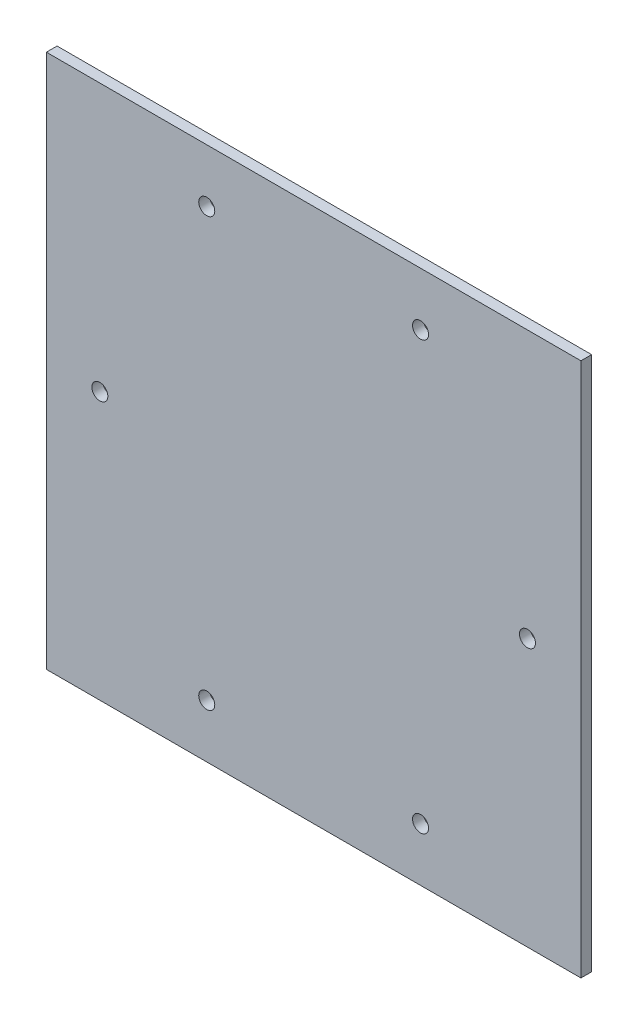
ISO-10303-21;
HEADER;
FILE_DESCRIPTION(('STEP AP214'),'2;1');
FILE_NAME('part.step','',(''),(''),'','','');
FILE_SCHEMA(('AUTOMOTIVE_DESIGN { 1 0 10303 214 1 1 1 1 }'));
ENDSEC;
DATA;
#1=APPLICATION_CONTEXT('core data for automotive mechanical design processes');
#2=APPLICATION_PROTOCOL_DEFINITION('international standard','automotive_design',2000,#1);
#3=PRODUCT_CONTEXT('',#1,'mechanical');
#4=PRODUCT('Part','Part','',(#3));
#5=PRODUCT_RELATED_PRODUCT_CATEGORY('part','',(#4));
#6=PRODUCT_DEFINITION_FORMATION('','',#4);
#7=PRODUCT_DEFINITION_CONTEXT('part definition',#1,'design');
#8=PRODUCT_DEFINITION('design','',#6,#7);
#9=PRODUCT_DEFINITION_SHAPE('','',#8);
#10=(LENGTH_UNIT() NAMED_UNIT(*) SI_UNIT(.MILLI.,.METRE.));
#11=(NAMED_UNIT(*) PLANE_ANGLE_UNIT() SI_UNIT($,.RADIAN.));
#12=(NAMED_UNIT(*) SI_UNIT($,.STERADIAN.) SOLID_ANGLE_UNIT());
#13=UNCERTAINTY_MEASURE_WITH_UNIT(LENGTH_MEASURE(1.E-05),#10,'distance_accuracy_value','');
#14=(GEOMETRIC_REPRESENTATION_CONTEXT(3) GLOBAL_UNCERTAINTY_ASSIGNED_CONTEXT((#13)) GLOBAL_UNIT_ASSIGNED_CONTEXT((#10,
#11,#12)) REPRESENTATION_CONTEXT('',''));
#15=CARTESIAN_POINT('',(0.,0.,0.));
#16=DIRECTION('',(0.,0.,1.));
#17=DIRECTION('',(1.,0.,0.));
#18=AXIS2_PLACEMENT_3D('',#15,#16,#17);
#19=CARTESIAN_POINT('',(50.,50.,2.));
#20=DIRECTION('',(0.,0.,-1.));
#21=DIRECTION('',(-1.,0.,0.));
#22=AXIS2_PLACEMENT_3D('',#19,#20,#21);
#23=PLANE('',#22);
#24=CARTESIAN_POINT('',(-20.,-40.,2.));
#25=DIRECTION('',(0.,0.,-1.));
#26=DIRECTION('',(1.,0.,0.));
#27=AXIS2_PLACEMENT_3D('',#24,#25,#26);
#28=CIRCLE('',#27,1.5);
#29=CARTESIAN_POINT('',(-18.5,-40.,2.));
#30=VERTEX_POINT('',#29);
#31=EDGE_CURVE('E124',#30,#30,#28,.T.);
#32=ORIENTED_EDGE('',*,*,#31,.T.);
#33=EDGE_LOOP('',(#32));
#34=FACE_BOUND('',#33,.T.);
#35=DIRECTION('',(0.,1.,0.));
#36=VECTOR('',#35,1.);
#37=CARTESIAN_POINT('',(50.,-50.,2.));
#38=LINE('',#37,#36);
#39=CARTESIAN_POINT('',(50.,-50.,2.));
#40=VERTEX_POINT('',#39);
#41=CARTESIAN_POINT('',(50.,50.,2.));
#42=VERTEX_POINT('',#41);
#43=EDGE_CURVE('E86',#40,#42,#38,.T.);
#44=ORIENTED_EDGE('',*,*,#43,.T.);
#45=DIRECTION('',(-1.,0.,0.));
#46=VECTOR('',#45,1.);
#47=CARTESIAN_POINT('',(-50.,50.,2.));
#48=LINE('',#47,#46);
#49=CARTESIAN_POINT('',(-50.,50.,2.));
#50=VERTEX_POINT('',#49);
#51=EDGE_CURVE('E81',#42,#50,#48,.T.);
#52=ORIENTED_EDGE('',*,*,#51,.T.);
#53=DIRECTION('',(0.,-1.,0.));
#54=VECTOR('',#53,1.);
#55=CARTESIAN_POINT('',(-50.,-50.,2.));
#56=LINE('',#55,#54);
#57=CARTESIAN_POINT('',(-50.,-50.,2.));
#58=VERTEX_POINT('',#57);
#59=EDGE_CURVE('E84',#50,#58,#56,.T.);
#60=ORIENTED_EDGE('',*,*,#59,.T.);
#61=DIRECTION('',(1.,0.,0.));
#62=VECTOR('',#61,1.);
#63=CARTESIAN_POINT('',(-50.,-50.,2.));
#64=LINE('',#63,#62);
#65=EDGE_CURVE('E51',#58,#40,#64,.T.);
#66=ORIENTED_EDGE('',*,*,#65,.T.);
#67=EDGE_LOOP('',(#44,#52,#60,#66));
#68=FACE_BOUND('',#67,.T.);
#69=CARTESIAN_POINT('',(-20.,40.,2.));
#70=DIRECTION('',(0.,0.,1.));
#71=DIRECTION('',(1.,0.,0.));
#72=AXIS2_PLACEMENT_3D('',#69,#70,#71);
#73=CIRCLE('',#72,1.5);
#74=CARTESIAN_POINT('',(-18.5,40.,2.));
#75=VERTEX_POINT('',#74);
#76=EDGE_CURVE('E110',#75,#75,#73,.T.);
#77=ORIENTED_EDGE('',*,*,#76,.F.);
#78=EDGE_LOOP('',(#77));
#79=FACE_BOUND('',#78,.T.);
#80=CARTESIAN_POINT('',(20.,40.,2.));
#81=DIRECTION('',(0.,0.,1.));
#82=DIRECTION('',(1.,0.,0.));
#83=AXIS2_PLACEMENT_3D('',#80,#81,#82);
#84=CIRCLE('',#83,1.5);
#85=CARTESIAN_POINT('',(21.5,40.,2.));
#86=VERTEX_POINT('',#85);
#87=EDGE_CURVE('E114',#86,#86,#84,.T.);
#88=ORIENTED_EDGE('',*,*,#87,.F.);
#89=EDGE_LOOP('',(#88));
#90=FACE_BOUND('',#89,.T.);
#91=CARTESIAN_POINT('',(-40.,0.,2.));
#92=DIRECTION('',(0.,0.,1.));
#93=DIRECTION('',(1.,0.,0.));
#94=AXIS2_PLACEMENT_3D('',#91,#92,#93);
#95=CIRCLE('',#94,1.5);
#96=CARTESIAN_POINT('',(-38.5,0.,2.));
#97=VERTEX_POINT('',#96);
#98=EDGE_CURVE('E118',#97,#97,#95,.T.);
#99=ORIENTED_EDGE('',*,*,#98,.F.);
#100=EDGE_LOOP('',(#99));
#101=FACE_BOUND('',#100,.T.);
#102=CARTESIAN_POINT('',(40.,0.,2.));
#103=DIRECTION('',(0.,0.,-1.));
#104=DIRECTION('',(-1.,0.,0.));
#105=AXIS2_PLACEMENT_3D('',#102,#103,#104);
#106=CIRCLE('',#105,1.5);
#107=CARTESIAN_POINT('',(38.5,0.,2.));
#108=VERTEX_POINT('',#107);
#109=EDGE_CURVE('E121',#108,#108,#106,.T.);
#110=ORIENTED_EDGE('',*,*,#109,.T.);
#111=EDGE_LOOP('',(#110));
#112=FACE_BOUND('',#111,.T.);
#113=CARTESIAN_POINT('',(20.,-40.,2.));
#114=DIRECTION('',(0.,0.,-1.));
#115=DIRECTION('',(1.,0.,0.));
#116=AXIS2_PLACEMENT_3D('',#113,#114,#115);
#117=CIRCLE('',#116,1.5);
#118=CARTESIAN_POINT('',(21.5,-40.,2.));
#119=VERTEX_POINT('',#118);
#120=EDGE_CURVE('E134',#119,#119,#117,.T.);
#121=ORIENTED_EDGE('',*,*,#120,.T.);
#122=EDGE_LOOP('',(#121));
#123=FACE_BOUND('',#122,.T.);
#124=ADVANCED_FACE('F32',(#34,#68,#79,#90,#101,#112,#123),#23,.F.);
#125=CARTESIAN_POINT('',(50.,50.,0.));
#126=DIRECTION('',(0.,0.,-1.));
#127=DIRECTION('',(-1.,0.,0.));
#128=AXIS2_PLACEMENT_3D('',#125,#126,#127);
#129=PLANE('',#128);
#130=CARTESIAN_POINT('',(-20.,-40.,0.));
#131=DIRECTION('',(0.,0.,-1.));
#132=DIRECTION('',(-1.,0.,0.));
#133=AXIS2_PLACEMENT_3D('',#130,#131,#132);
#134=CIRCLE('',#133,1.5);
#135=CARTESIAN_POINT('',(-21.5,-40.,0.));
#136=VERTEX_POINT('',#135);
#137=EDGE_CURVE('E122',#136,#136,#134,.F.);
#138=ORIENTED_EDGE('',*,*,#137,.T.);
#139=EDGE_LOOP('',(#138));
#140=FACE_BOUND('',#139,.T.);
#141=DIRECTION('',(0.,1.,0.));
#142=VECTOR('',#141,1.);
#143=CARTESIAN_POINT('',(50.,-50.,0.));
#144=LINE('',#143,#142);
#145=CARTESIAN_POINT('',(50.,-50.,0.));
#146=VERTEX_POINT('',#145);
#147=CARTESIAN_POINT('',(50.,50.,0.));
#148=VERTEX_POINT('',#147);
#149=EDGE_CURVE('E99',#146,#148,#144,.T.);
#150=ORIENTED_EDGE('',*,*,#149,.F.);
#151=DIRECTION('',(1.,0.,0.));
#152=VECTOR('',#151,1.);
#153=CARTESIAN_POINT('',(-50.,-50.,0.));
#154=LINE('',#153,#152);
#155=CARTESIAN_POINT('',(-50.,-50.,0.));
#156=VERTEX_POINT('',#155);
#157=EDGE_CURVE('E74',#156,#146,#154,.T.);
#158=ORIENTED_EDGE('',*,*,#157,.F.);
#159=DIRECTION('',(0.,-1.,0.));
#160=VECTOR('',#159,1.);
#161=CARTESIAN_POINT('',(-50.,-50.,0.));
#162=LINE('',#161,#160);
#163=CARTESIAN_POINT('',(-50.,50.,0.));
#164=VERTEX_POINT('',#163);
#165=EDGE_CURVE('E68',#164,#156,#162,.T.);
#166=ORIENTED_EDGE('',*,*,#165,.F.);
#167=DIRECTION('',(-1.,0.,0.));
#168=VECTOR('',#167,1.);
#169=CARTESIAN_POINT('',(-50.,50.,0.));
#170=LINE('',#169,#168);
#171=EDGE_CURVE('E90',#148,#164,#170,.T.);
#172=ORIENTED_EDGE('',*,*,#171,.F.);
#173=EDGE_LOOP('',(#150,#158,#166,#172));
#174=FACE_BOUND('',#173,.T.);
#175=CARTESIAN_POINT('',(-20.,40.,0.));
#176=DIRECTION('',(0.,0.,-1.));
#177=DIRECTION('',(-1.,0.,0.));
#178=AXIS2_PLACEMENT_3D('',#175,#176,#177);
#179=CIRCLE('',#178,1.5);
#180=CARTESIAN_POINT('',(-21.5,40.,0.));
#181=VERTEX_POINT('',#180);
#182=EDGE_CURVE('E102',#181,#181,#179,.T.);
#183=ORIENTED_EDGE('',*,*,#182,.F.);
#184=EDGE_LOOP('',(#183));
#185=FACE_BOUND('',#184,.T.);
#186=CARTESIAN_POINT('',(20.,40.,0.));
#187=DIRECTION('',(0.,0.,-1.));
#188=DIRECTION('',(-1.,0.,0.));
#189=AXIS2_PLACEMENT_3D('',#186,#187,#188);
#190=CIRCLE('',#189,1.5);
#191=CARTESIAN_POINT('',(18.5,40.,0.));
#192=VERTEX_POINT('',#191);
#193=EDGE_CURVE('E111',#192,#192,#190,.T.);
#194=ORIENTED_EDGE('',*,*,#193,.F.);
#195=EDGE_LOOP('',(#194));
#196=FACE_BOUND('',#195,.T.);
#197=CARTESIAN_POINT('',(-40.,0.,0.));
#198=DIRECTION('',(0.,0.,-1.));
#199=DIRECTION('',(-1.,0.,0.));
#200=AXIS2_PLACEMENT_3D('',#197,#198,#199);
#201=CIRCLE('',#200,1.5);
#202=CARTESIAN_POINT('',(-41.5,0.,0.));
#203=VERTEX_POINT('',#202);
#204=EDGE_CURVE('E115',#203,#203,#201,.T.);
#205=ORIENTED_EDGE('',*,*,#204,.F.);
#206=EDGE_LOOP('',(#205));
#207=FACE_BOUND('',#206,.T.);
#208=CARTESIAN_POINT('',(40.,0.,0.));
#209=DIRECTION('',(0.,0.,-1.));
#210=DIRECTION('',(-1.,0.,0.));
#211=AXIS2_PLACEMENT_3D('',#208,#209,#210);
#212=CIRCLE('',#211,1.5);
#213=CARTESIAN_POINT('',(38.5,0.,0.));
#214=VERTEX_POINT('',#213);
#215=EDGE_CURVE('E119',#214,#214,#212,.F.);
#216=ORIENTED_EDGE('',*,*,#215,.T.);
#217=EDGE_LOOP('',(#216));
#218=FACE_BOUND('',#217,.T.);
#219=CARTESIAN_POINT('',(20.,-40.,0.));
#220=DIRECTION('',(0.,0.,-1.));
#221=DIRECTION('',(-1.,0.,0.));
#222=AXIS2_PLACEMENT_3D('',#219,#220,#221);
#223=CIRCLE('',#222,1.5);
#224=CARTESIAN_POINT('',(18.5,-40.,0.));
#225=VERTEX_POINT('',#224);
#226=EDGE_CURVE('E36',#225,#225,#223,.F.);
#227=ORIENTED_EDGE('',*,*,#226,.T.);
#228=EDGE_LOOP('',(#227));
#229=FACE_BOUND('',#228,.T.);
#230=ADVANCED_FACE('F147',(#140,#174,#185,#196,#207,#218,#229),#129,.T.);
#231=CARTESIAN_POINT('',(50.,-50.,2.));
#232=DIRECTION('',(-1.,0.,0.));
#233=DIRECTION('',(0.,0.,1.));
#234=AXIS2_PLACEMENT_3D('',#231,#232,#233);
#235=PLANE('',#234);
#236=ORIENTED_EDGE('',*,*,#149,.T.);
#237=DIRECTION('',(0.,0.,-1.));
#238=VECTOR('',#237,1.);
#239=CARTESIAN_POINT('',(50.,50.,2.));
#240=LINE('',#239,#238);
#241=EDGE_CURVE('E11',#42,#148,#240,.T.);
#242=ORIENTED_EDGE('',*,*,#241,.F.);
#243=ORIENTED_EDGE('',*,*,#43,.F.);
#244=DIRECTION('',(0.,0.,-1.));
#245=VECTOR('',#244,1.);
#246=CARTESIAN_POINT('',(50.,-50.,2.));
#247=LINE('',#246,#245);
#248=EDGE_CURVE('E95',#40,#146,#247,.T.);
#249=ORIENTED_EDGE('',*,*,#248,.T.);
#250=EDGE_LOOP('',(#236,#242,#243,#249));
#251=FACE_BOUND('',#250,.T.);
#252=ADVANCED_FACE('F34',(#251),#235,.F.);
#253=CARTESIAN_POINT('',(-50.,50.,2.));
#254=DIRECTION('',(0.,-1.,0.));
#255=DIRECTION('',(0.,0.,-1.));
#256=AXIS2_PLACEMENT_3D('',#253,#254,#255);
#257=PLANE('',#256);
#258=ORIENTED_EDGE('',*,*,#171,.T.);
#259=DIRECTION('',(0.,0.,-1.));
#260=VECTOR('',#259,1.);
#261=CARTESIAN_POINT('',(-50.,50.,2.));
#262=LINE('',#261,#260);
#263=EDGE_CURVE('E42',#50,#164,#262,.T.);
#264=ORIENTED_EDGE('',*,*,#263,.F.);
#265=ORIENTED_EDGE('',*,*,#51,.F.);
#266=ORIENTED_EDGE('',*,*,#241,.T.);
#267=EDGE_LOOP('',(#258,#264,#265,#266));
#268=FACE_BOUND('',#267,.T.);
#269=ADVANCED_FACE('F89',(#268),#257,.F.);
#270=CARTESIAN_POINT('',(-50.,-50.,2.));
#271=DIRECTION('',(1.,0.,0.));
#272=DIRECTION('',(0.,0.,-1.));
#273=AXIS2_PLACEMENT_3D('',#270,#271,#272);
#274=PLANE('',#273);
#275=ORIENTED_EDGE('',*,*,#165,.T.);
#276=DIRECTION('',(0.,0.,-1.));
#277=VECTOR('',#276,1.);
#278=CARTESIAN_POINT('',(-50.,-50.,2.));
#279=LINE('',#278,#277);
#280=EDGE_CURVE('E91',#58,#156,#279,.T.);
#281=ORIENTED_EDGE('',*,*,#280,.F.);
#282=ORIENTED_EDGE('',*,*,#59,.F.);
#283=ORIENTED_EDGE('',*,*,#263,.T.);
#284=EDGE_LOOP('',(#275,#281,#282,#283));
#285=FACE_BOUND('',#284,.T.);
#286=ADVANCED_FACE('F93',(#285),#274,.F.);
#287=CARTESIAN_POINT('',(-50.,-50.,2.));
#288=DIRECTION('',(0.,1.,0.));
#289=DIRECTION('',(0.,0.,1.));
#290=AXIS2_PLACEMENT_3D('',#287,#288,#289);
#291=PLANE('',#290);
#292=ORIENTED_EDGE('',*,*,#157,.T.);
#293=ORIENTED_EDGE('',*,*,#248,.F.);
#294=ORIENTED_EDGE('',*,*,#65,.F.);
#295=ORIENTED_EDGE('',*,*,#280,.T.);
#296=EDGE_LOOP('',(#292,#293,#294,#295));
#297=FACE_BOUND('',#296,.T.);
#298=ADVANCED_FACE('F183',(#297),#291,.F.);
#299=CARTESIAN_POINT('',(-20.,40.,-8.));
#300=DIRECTION('',(0.,0.,1.));
#301=DIRECTION('',(1.,0.,0.));
#302=AXIS2_PLACEMENT_3D('',#299,#300,#301);
#303=CYLINDRICAL_SURFACE('',#302,1.5);
#304=ORIENTED_EDGE('',*,*,#182,.T.);
#305=EDGE_LOOP('',(#304));
#306=FACE_BOUND('',#305,.T.);
#307=ORIENTED_EDGE('',*,*,#76,.T.);
#308=EDGE_LOOP('',(#307));
#309=FACE_BOUND('',#308,.T.);
#310=ADVANCED_FACE('F144',(#306,#309),#303,.F.);
#311=CARTESIAN_POINT('',(20.,40.,-8.));
#312=DIRECTION('',(0.,0.,1.));
#313=DIRECTION('',(1.,0.,0.));
#314=AXIS2_PLACEMENT_3D('',#311,#312,#313);
#315=CYLINDRICAL_SURFACE('',#314,1.5);
#316=ORIENTED_EDGE('',*,*,#193,.T.);
#317=EDGE_LOOP('',(#316));
#318=FACE_BOUND('',#317,.T.);
#319=ORIENTED_EDGE('',*,*,#87,.T.);
#320=EDGE_LOOP('',(#319));
#321=FACE_BOUND('',#320,.T.);
#322=ADVANCED_FACE('F177',(#318,#321),#315,.F.);
#323=CARTESIAN_POINT('',(-40.,0.,-8.));
#324=DIRECTION('',(0.,0.,1.));
#325=DIRECTION('',(1.,0.,0.));
#326=AXIS2_PLACEMENT_3D('',#323,#324,#325);
#327=CYLINDRICAL_SURFACE('',#326,1.5);
#328=ORIENTED_EDGE('',*,*,#204,.T.);
#329=EDGE_LOOP('',(#328));
#330=FACE_BOUND('',#329,.T.);
#331=ORIENTED_EDGE('',*,*,#98,.T.);
#332=EDGE_LOOP('',(#331));
#333=FACE_BOUND('',#332,.T.);
#334=ADVANCED_FACE('F173',(#330,#333),#327,.F.);
#335=CARTESIAN_POINT('',(40.,0.,-8.));
#336=DIRECTION('',(0.,0.,1.));
#337=DIRECTION('',(1.,0.,0.));
#338=AXIS2_PLACEMENT_3D('',#335,#336,#337);
#339=CYLINDRICAL_SURFACE('',#338,1.5);
#340=ORIENTED_EDGE('',*,*,#215,.F.);
#341=EDGE_LOOP('',(#340));
#342=FACE_BOUND('',#341,.T.);
#343=ORIENTED_EDGE('',*,*,#109,.F.);
#344=EDGE_LOOP('',(#343));
#345=FACE_BOUND('',#344,.T.);
#346=ADVANCED_FACE('F166',(#342,#345),#339,.F.);
#347=CARTESIAN_POINT('',(-20.,-40.,-8.));
#348=DIRECTION('',(0.,0.,1.));
#349=DIRECTION('',(1.,0.,0.));
#350=AXIS2_PLACEMENT_3D('',#347,#348,#349);
#351=CYLINDRICAL_SURFACE('',#350,1.5);
#352=ORIENTED_EDGE('',*,*,#137,.F.);
#353=EDGE_LOOP('',(#352));
#354=FACE_BOUND('',#353,.T.);
#355=ORIENTED_EDGE('',*,*,#31,.F.);
#356=EDGE_LOOP('',(#355));
#357=FACE_BOUND('',#356,.T.);
#358=ADVANCED_FACE('F160',(#354,#357),#351,.F.);
#359=CARTESIAN_POINT('',(20.,-40.,-8.));
#360=DIRECTION('',(0.,0.,1.));
#361=DIRECTION('',(1.,0.,0.));
#362=AXIS2_PLACEMENT_3D('',#359,#360,#361);
#363=CYLINDRICAL_SURFACE('',#362,1.5);
#364=ORIENTED_EDGE('',*,*,#226,.F.);
#365=EDGE_LOOP('',(#364));
#366=FACE_BOUND('',#365,.T.);
#367=ORIENTED_EDGE('',*,*,#120,.F.);
#368=EDGE_LOOP('',(#367));
#369=FACE_BOUND('',#368,.T.);
#370=ADVANCED_FACE('F158',(#366,#369),#363,.F.);
#371=CLOSED_SHELL('',(#124,#230,#252,#269,#286,#298,#310,#322,#334,#346,#358,#370));
#372=MANIFOLD_SOLID_BREP('B2',#371);
#373=ADVANCED_BREP_SHAPE_REPRESENTATION('',(#18,#372),#14);
#374=SHAPE_DEFINITION_REPRESENTATION(#9,#373);
ENDSEC;
END-ISO-10303-21;
